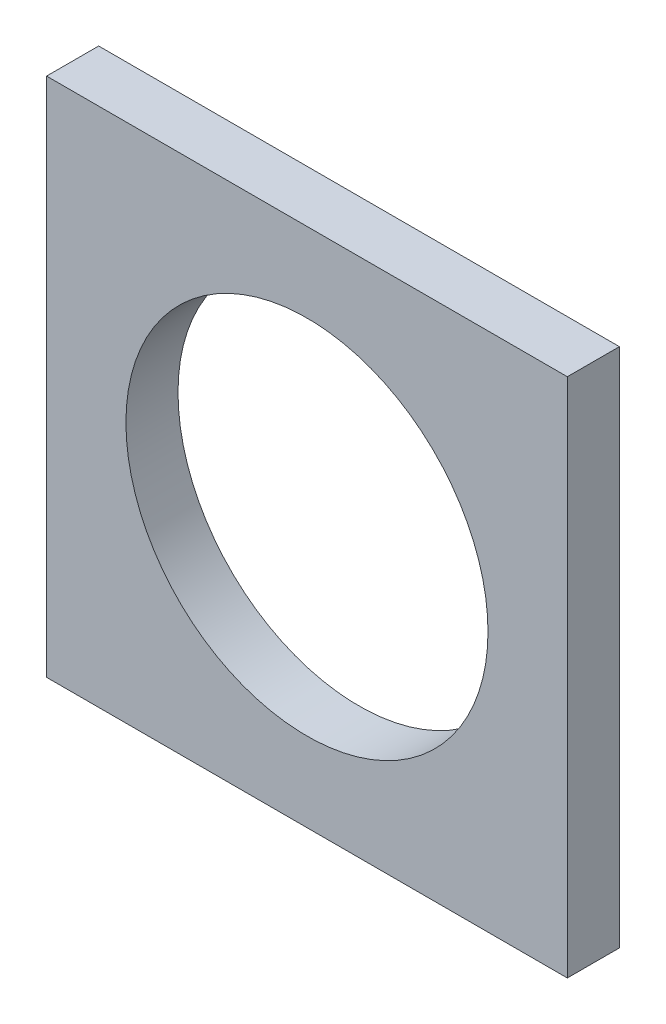
ISO-10303-21;
HEADER;
FILE_DESCRIPTION(('STEP AP214'),'2;1');
FILE_NAME('part.step','',(''),(''),'','','');
FILE_SCHEMA(('AUTOMOTIVE_DESIGN { 1 0 10303 214 1 1 1 1 }'));
ENDSEC;
DATA;
#1=APPLICATION_CONTEXT('core data for automotive mechanical design processes');
#2=APPLICATION_PROTOCOL_DEFINITION('international standard','automotive_design',2000,#1);
#3=PRODUCT_CONTEXT('',#1,'mechanical');
#4=PRODUCT('Part','Part','',(#3));
#5=PRODUCT_RELATED_PRODUCT_CATEGORY('part','',(#4));
#6=PRODUCT_DEFINITION_FORMATION('','',#4);
#7=PRODUCT_DEFINITION_CONTEXT('part definition',#1,'design');
#8=PRODUCT_DEFINITION('design','',#6,#7);
#9=PRODUCT_DEFINITION_SHAPE('','',#8);
#10=(LENGTH_UNIT() NAMED_UNIT(*) SI_UNIT(.MILLI.,.METRE.));
#11=(NAMED_UNIT(*) PLANE_ANGLE_UNIT() SI_UNIT($,.RADIAN.));
#12=(NAMED_UNIT(*) SI_UNIT($,.STERADIAN.) SOLID_ANGLE_UNIT());
#13=UNCERTAINTY_MEASURE_WITH_UNIT(LENGTH_MEASURE(1.E-05),#10,'distance_accuracy_value','');
#14=(GEOMETRIC_REPRESENTATION_CONTEXT(3) GLOBAL_UNCERTAINTY_ASSIGNED_CONTEXT((#13)) GLOBAL_UNIT_ASSIGNED_CONTEXT((#10,
#11,#12)) REPRESENTATION_CONTEXT('',''));
#15=CARTESIAN_POINT('',(0.,0.,0.));
#16=DIRECTION('',(0.,0.,1.));
#17=DIRECTION('',(1.,0.,0.));
#18=AXIS2_PLACEMENT_3D('',#15,#16,#17);
#19=CARTESIAN_POINT('',(0.,0.,10.));
#20=DIRECTION('',(0.,0.,-1.));
#21=DIRECTION('',(-1.,0.,0.));
#22=AXIS2_PLACEMENT_3D('',#19,#20,#21);
#23=PLANE('',#22);
#24=DIRECTION('',(0.,1.,0.));
#25=VECTOR('',#24,1.);
#26=CARTESIAN_POINT('',(50.,-50.,10.));
#27=LINE('',#26,#25);
#28=CARTESIAN_POINT('',(50.,-50.,10.));
#29=VERTEX_POINT('',#28);
#30=CARTESIAN_POINT('',(50.,50.,10.));
#31=VERTEX_POINT('',#30);
#32=EDGE_CURVE('E96',#29,#31,#27,.T.);
#33=ORIENTED_EDGE('',*,*,#32,.T.);
#34=DIRECTION('',(-1.,0.,0.));
#35=VECTOR('',#34,1.);
#36=CARTESIAN_POINT('',(-50.,50.,10.));
#37=LINE('',#36,#35);
#38=CARTESIAN_POINT('',(-50.,50.,10.));
#39=VERTEX_POINT('',#38);
#40=EDGE_CURVE('E91',#31,#39,#37,.T.);
#41=ORIENTED_EDGE('',*,*,#40,.T.);
#42=DIRECTION('',(0.,-1.,0.));
#43=VECTOR('',#42,1.);
#44=CARTESIAN_POINT('',(-50.,-50.,10.));
#45=LINE('',#44,#43);
#46=CARTESIAN_POINT('',(-50.,-50.,10.));
#47=VERTEX_POINT('',#46);
#48=EDGE_CURVE('E94',#39,#47,#45,.T.);
#49=ORIENTED_EDGE('',*,*,#48,.T.);
#50=DIRECTION('',(1.,0.,0.));
#51=VECTOR('',#50,1.);
#52=CARTESIAN_POINT('',(-50.,-50.,10.));
#53=LINE('',#52,#51);
#54=EDGE_CURVE('E61',#47,#29,#53,.T.);
#55=ORIENTED_EDGE('',*,*,#54,.T.);
#56=EDGE_LOOP('',(#33,#41,#49,#55));
#57=FACE_BOUND('',#56,.T.);
#58=CARTESIAN_POINT('',(0.,0.,10.));
#59=DIRECTION('',(0.,0.,1.));
#60=DIRECTION('',(1.,0.,0.));
#61=AXIS2_PLACEMENT_3D('',#58,#59,#60);
#62=CIRCLE('',#61,34.764618621221);
#63=CARTESIAN_POINT('',(34.764618621221,0.,10.));
#64=VERTEX_POINT('',#63);
#65=EDGE_CURVE('E116',#64,#64,#62,.T.);
#66=ORIENTED_EDGE('',*,*,#65,.F.);
#67=EDGE_LOOP('',(#66));
#68=FACE_BOUND('',#67,.T.);
#69=ADVANCED_FACE('F43',(#57,#68),#23,.F.);
#70=CARTESIAN_POINT('',(0.,0.,0.));
#71=DIRECTION('',(0.,0.,-1.));
#72=DIRECTION('',(-1.,0.,0.));
#73=AXIS2_PLACEMENT_3D('',#70,#71,#72);
#74=PLANE('',#73);
#75=DIRECTION('',(0.,1.,0.));
#76=VECTOR('',#75,1.);
#77=CARTESIAN_POINT('',(50.,-50.,0.));
#78=LINE('',#77,#76);
#79=CARTESIAN_POINT('',(50.,-50.,0.));
#80=VERTEX_POINT('',#79);
#81=CARTESIAN_POINT('',(50.,50.,0.));
#82=VERTEX_POINT('',#81);
#83=EDGE_CURVE('E112',#80,#82,#78,.T.);
#84=ORIENTED_EDGE('',*,*,#83,.F.);
#85=DIRECTION('',(1.,0.,0.));
#86=VECTOR('',#85,1.);
#87=CARTESIAN_POINT('',(-50.,-50.,0.));
#88=LINE('',#87,#86);
#89=CARTESIAN_POINT('',(-50.,-50.,0.));
#90=VERTEX_POINT('',#89);
#91=EDGE_CURVE('E84',#90,#80,#88,.T.);
#92=ORIENTED_EDGE('',*,*,#91,.F.);
#93=DIRECTION('',(0.,-1.,0.));
#94=VECTOR('',#93,1.);
#95=CARTESIAN_POINT('',(-50.,-50.,0.));
#96=LINE('',#95,#94);
#97=CARTESIAN_POINT('',(-50.,50.,0.));
#98=VERTEX_POINT('',#97);
#99=EDGE_CURVE('E78',#98,#90,#96,.T.);
#100=ORIENTED_EDGE('',*,*,#99,.F.);
#101=DIRECTION('',(-1.,0.,0.));
#102=VECTOR('',#101,1.);
#103=CARTESIAN_POINT('',(-50.,50.,0.));
#104=LINE('',#103,#102);
#105=EDGE_CURVE('E101',#82,#98,#104,.T.);
#106=ORIENTED_EDGE('',*,*,#105,.F.);
#107=EDGE_LOOP('',(#84,#92,#100,#106));
#108=FACE_BOUND('',#107,.T.);
#109=CARTESIAN_POINT('',(0.,0.,0.));
#110=DIRECTION('',(0.,0.,1.));
#111=DIRECTION('',(1.,0.,0.));
#112=AXIS2_PLACEMENT_3D('',#109,#110,#111);
#113=CIRCLE('',#112,34.764618621221);
#114=CARTESIAN_POINT('',(34.764618621221,0.,0.));
#115=VERTEX_POINT('',#114);
#116=EDGE_CURVE('E134',#115,#115,#113,.T.);
#117=ORIENTED_EDGE('',*,*,#116,.T.);
#118=EDGE_LOOP('',(#117));
#119=FACE_BOUND('',#118,.T.);
#120=ADVANCED_FACE('F129',(#108,#119),#74,.T.);
#121=CARTESIAN_POINT('',(50.,-50.,10.));
#122=DIRECTION('',(-1.,0.,0.));
#123=DIRECTION('',(0.,0.,1.));
#124=AXIS2_PLACEMENT_3D('',#121,#122,#123);
#125=PLANE('',#124);
#126=ORIENTED_EDGE('',*,*,#83,.T.);
#127=DIRECTION('',(0.,0.,-1.));
#128=VECTOR('',#127,1.);
#129=CARTESIAN_POINT('',(50.,50.,10.));
#130=LINE('',#129,#128);
#131=EDGE_CURVE('E11',#31,#82,#130,.T.);
#132=ORIENTED_EDGE('',*,*,#131,.F.);
#133=ORIENTED_EDGE('',*,*,#32,.F.);
#134=DIRECTION('',(0.,0.,-1.));
#135=VECTOR('',#134,1.);
#136=CARTESIAN_POINT('',(50.,-50.,10.));
#137=LINE('',#136,#135);
#138=EDGE_CURVE('E108',#29,#80,#137,.T.);
#139=ORIENTED_EDGE('',*,*,#138,.T.);
#140=EDGE_LOOP('',(#126,#132,#133,#139));
#141=FACE_BOUND('',#140,.T.);
#142=ADVANCED_FACE('F45',(#141),#125,.F.);
#143=CARTESIAN_POINT('',(-50.,50.,10.));
#144=DIRECTION('',(0.,-1.,0.));
#145=DIRECTION('',(0.,0.,-1.));
#146=AXIS2_PLACEMENT_3D('',#143,#144,#145);
#147=PLANE('',#146);
#148=ORIENTED_EDGE('',*,*,#105,.T.);
#149=DIRECTION('',(0.,0.,-1.));
#150=VECTOR('',#149,1.);
#151=CARTESIAN_POINT('',(-50.,50.,10.));
#152=LINE('',#151,#150);
#153=EDGE_CURVE('E53',#39,#98,#152,.T.);
#154=ORIENTED_EDGE('',*,*,#153,.F.);
#155=ORIENTED_EDGE('',*,*,#40,.F.);
#156=ORIENTED_EDGE('',*,*,#131,.T.);
#157=EDGE_LOOP('',(#148,#154,#155,#156));
#158=FACE_BOUND('',#157,.T.);
#159=ADVANCED_FACE('F100',(#158),#147,.F.);
#160=CARTESIAN_POINT('',(-50.,-50.,10.));
#161=DIRECTION('',(1.,0.,0.));
#162=DIRECTION('',(0.,0.,-1.));
#163=AXIS2_PLACEMENT_3D('',#160,#161,#162);
#164=PLANE('',#163);
#165=ORIENTED_EDGE('',*,*,#99,.T.);
#166=DIRECTION('',(0.,0.,-1.));
#167=VECTOR('',#166,1.);
#168=CARTESIAN_POINT('',(-50.,-50.,10.));
#169=LINE('',#168,#167);
#170=EDGE_CURVE('E103',#47,#90,#169,.T.);
#171=ORIENTED_EDGE('',*,*,#170,.F.);
#172=ORIENTED_EDGE('',*,*,#48,.F.);
#173=ORIENTED_EDGE('',*,*,#153,.T.);
#174=EDGE_LOOP('',(#165,#171,#172,#173));
#175=FACE_BOUND('',#174,.T.);
#176=ADVANCED_FACE('F104',(#175),#164,.F.);
#177=CARTESIAN_POINT('',(-50.,-50.,10.));
#178=DIRECTION('',(0.,1.,0.));
#179=DIRECTION('',(0.,0.,1.));
#180=AXIS2_PLACEMENT_3D('',#177,#178,#179);
#181=PLANE('',#180);
#182=ORIENTED_EDGE('',*,*,#91,.T.);
#183=ORIENTED_EDGE('',*,*,#138,.F.);
#184=ORIENTED_EDGE('',*,*,#54,.F.);
#185=ORIENTED_EDGE('',*,*,#170,.T.);
#186=EDGE_LOOP('',(#182,#183,#184,#185));
#187=FACE_BOUND('',#186,.T.);
#188=ADVANCED_FACE('F126',(#187),#181,.F.);
#189=CARTESIAN_POINT('',(0.,0.,10.));
#190=DIRECTION('',(0.,0.,-1.));
#191=DIRECTION('',(-1.,0.,0.));
#192=AXIS2_PLACEMENT_3D('',#189,#190,#191);
#193=CYLINDRICAL_SURFACE('',#192,34.764618621221);
#194=ORIENTED_EDGE('',*,*,#65,.T.);
#195=EDGE_LOOP('',(#194));
#196=FACE_BOUND('',#195,.T.);
#197=ORIENTED_EDGE('',*,*,#116,.F.);
#198=EDGE_LOOP('',(#197));
#199=FACE_BOUND('',#198,.T.);
#200=ADVANCED_FACE('F142',(#196,#199),#193,.F.);
#201=CLOSED_SHELL('',(#69,#120,#142,#159,#176,#188,#200));
#202=MANIFOLD_SOLID_BREP('B2',#201);
#203=ADVANCED_BREP_SHAPE_REPRESENTATION('',(#18,#202),#14);
#204=SHAPE_DEFINITION_REPRESENTATION(#9,#203);
ENDSEC;
END-ISO-10303-21;
